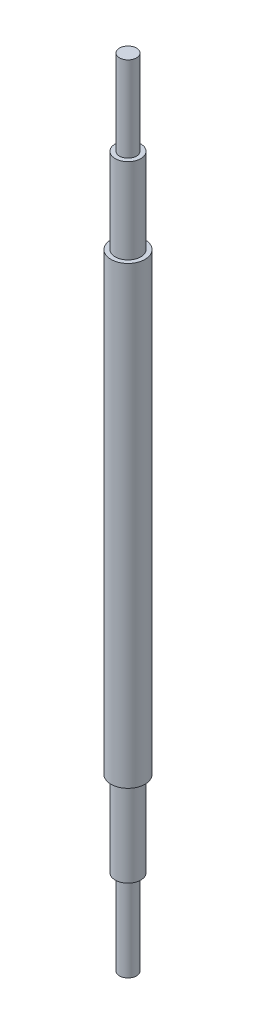
ISO-10303-21;
HEADER;
FILE_DESCRIPTION(('STEP AP214'),'2;1');
FILE_NAME('part.step','',(''),(''),'','','');
FILE_SCHEMA(('AUTOMOTIVE_DESIGN { 1 0 10303 214 1 1 1 1 }'));
ENDSEC;
DATA;
#1=APPLICATION_CONTEXT('core data for automotive mechanical design processes');
#2=APPLICATION_PROTOCOL_DEFINITION('international standard','automotive_design',2000,#1);
#3=PRODUCT_CONTEXT('',#1,'mechanical');
#4=PRODUCT('Part','Part','',(#3));
#5=PRODUCT_RELATED_PRODUCT_CATEGORY('part','',(#4));
#6=PRODUCT_DEFINITION_FORMATION('','',#4);
#7=PRODUCT_DEFINITION_CONTEXT('part definition',#1,'design');
#8=PRODUCT_DEFINITION('design','',#6,#7);
#9=PRODUCT_DEFINITION_SHAPE('','',#8);
#10=(LENGTH_UNIT() NAMED_UNIT(*) SI_UNIT(.MILLI.,.METRE.));
#11=(NAMED_UNIT(*) PLANE_ANGLE_UNIT() SI_UNIT($,.RADIAN.));
#12=(NAMED_UNIT(*) SI_UNIT($,.STERADIAN.) SOLID_ANGLE_UNIT());
#13=UNCERTAINTY_MEASURE_WITH_UNIT(LENGTH_MEASURE(1.E-05),#10,'distance_accuracy_value','');
#14=(GEOMETRIC_REPRESENTATION_CONTEXT(3) GLOBAL_UNCERTAINTY_ASSIGNED_CONTEXT((#13)) GLOBAL_UNIT_ASSIGNED_CONTEXT((#10,
#11,#12)) REPRESENTATION_CONTEXT('',''));
#15=CARTESIAN_POINT('',(0.,0.,0.));
#16=DIRECTION('',(0.,0.,1.));
#17=DIRECTION('',(1.,0.,0.));
#18=AXIS2_PLACEMENT_3D('',#15,#16,#17);
#19=CARTESIAN_POINT('',(0.,106.8,0.));
#20=DIRECTION('',(0.,-1.,0.));
#21=DIRECTION('',(0.,0.,-1.));
#22=AXIS2_PLACEMENT_3D('',#19,#20,#21);
#23=CYLINDRICAL_SURFACE('',#22,4.);
#24=CARTESIAN_POINT('',(0.,106.8,0.));
#25=DIRECTION('',(0.,1.,0.));
#26=DIRECTION('',(0.,0.,1.));
#27=AXIS2_PLACEMENT_3D('',#24,#25,#26);
#28=CIRCLE('',#27,4.);
#29=CARTESIAN_POINT('',(0.,106.8,4.));
#30=VERTEX_POINT('',#29);
#31=EDGE_CURVE('E41',#30,#30,#28,.T.);
#32=ORIENTED_EDGE('',*,*,#31,.F.);
#33=EDGE_LOOP('',(#32));
#34=FACE_BOUND('',#33,.T.);
#35=CARTESIAN_POINT('',(0.,0.,0.));
#36=DIRECTION('',(0.,1.,0.));
#37=DIRECTION('',(0.,0.,1.));
#38=AXIS2_PLACEMENT_3D('',#35,#36,#37);
#39=CIRCLE('',#38,4.);
#40=CARTESIAN_POINT('',(0.,0.,4.));
#41=VERTEX_POINT('',#40);
#42=EDGE_CURVE('E45',#41,#41,#39,.T.);
#43=ORIENTED_EDGE('',*,*,#42,.T.);
#44=EDGE_LOOP('',(#43));
#45=FACE_BOUND('',#44,.T.);
#46=ADVANCED_FACE('F35',(#34,#45),#23,.T.);
#47=CARTESIAN_POINT('',(0.,106.8,0.));
#48=DIRECTION('',(0.,1.,0.));
#49=DIRECTION('',(0.,0.,1.));
#50=AXIS2_PLACEMENT_3D('',#47,#48,#49);
#51=PLANE('',#50);
#52=CARTESIAN_POINT('',(0.,106.8,0.));
#53=DIRECTION('',(0.,1.,0.));
#54=DIRECTION('',(0.,0.,1.));
#55=AXIS2_PLACEMENT_3D('',#52,#53,#54);
#56=CIRCLE('',#55,3.);
#57=CARTESIAN_POINT('',(0.,106.8,3.));
#58=VERTEX_POINT('',#57);
#59=EDGE_CURVE('E52',#58,#58,#56,.T.);
#60=ORIENTED_EDGE('',*,*,#59,.F.);
#61=EDGE_LOOP('',(#60));
#62=FACE_BOUND('',#61,.T.);
#63=ORIENTED_EDGE('',*,*,#31,.T.);
#64=EDGE_LOOP('',(#63));
#65=FACE_BOUND('',#64,.T.);
#66=ADVANCED_FACE('F98',(#62,#65),#51,.T.);
#67=CARTESIAN_POINT('',(0.,0.,0.));
#68=DIRECTION('',(0.,1.,0.));
#69=DIRECTION('',(0.,0.,1.));
#70=AXIS2_PLACEMENT_3D('',#67,#68,#69);
#71=PLANE('',#70);
#72=CARTESIAN_POINT('',(0.,0.,0.));
#73=DIRECTION('',(0.,1.,0.));
#74=DIRECTION('',(0.,0.,1.));
#75=AXIS2_PLACEMENT_3D('',#72,#73,#74);
#76=CIRCLE('',#75,3.);
#77=CARTESIAN_POINT('',(0.,0.,3.));
#78=VERTEX_POINT('',#77);
#79=EDGE_CURVE('E10',#78,#78,#76,.F.);
#80=ORIENTED_EDGE('',*,*,#79,.F.);
#81=EDGE_LOOP('',(#80));
#82=FACE_BOUND('',#81,.T.);
#83=ORIENTED_EDGE('',*,*,#42,.F.);
#84=EDGE_LOOP('',(#83));
#85=FACE_BOUND('',#84,.T.);
#86=ADVANCED_FACE('F103',(#82,#85),#71,.F.);
#87=CARTESIAN_POINT('',(0.,126.8,0.));
#88=DIRECTION('',(0.,-1.,0.));
#89=DIRECTION('',(0.,0.,-1.));
#90=AXIS2_PLACEMENT_3D('',#87,#88,#89);
#91=CYLINDRICAL_SURFACE('',#90,3.);
#92=CARTESIAN_POINT('',(0.,126.8,0.));
#93=DIRECTION('',(0.,1.,0.));
#94=DIRECTION('',(0.,0.,1.));
#95=AXIS2_PLACEMENT_3D('',#92,#93,#94);
#96=CIRCLE('',#95,3.);
#97=CARTESIAN_POINT('',(0.,126.8,3.));
#98=VERTEX_POINT('',#97);
#99=EDGE_CURVE('E50',#98,#98,#96,.T.);
#100=ORIENTED_EDGE('',*,*,#99,.F.);
#101=EDGE_LOOP('',(#100));
#102=FACE_BOUND('',#101,.T.);
#103=ORIENTED_EDGE('',*,*,#59,.T.);
#104=EDGE_LOOP('',(#103));
#105=FACE_BOUND('',#104,.T.);
#106=ADVANCED_FACE('F110',(#102,#105),#91,.T.);
#107=CARTESIAN_POINT('',(0.,126.8,0.));
#108=DIRECTION('',(0.,1.,0.));
#109=DIRECTION('',(0.,0.,1.));
#110=AXIS2_PLACEMENT_3D('',#107,#108,#109);
#111=PLANE('',#110);
#112=CARTESIAN_POINT('',(0.,126.8,0.));
#113=DIRECTION('',(0.,1.,0.));
#114=DIRECTION('',(0.,0.,1.));
#115=AXIS2_PLACEMENT_3D('',#112,#113,#114);
#116=CIRCLE('',#115,2.);
#117=CARTESIAN_POINT('',(0.,126.8,2.));
#118=VERTEX_POINT('',#117);
#119=EDGE_CURVE('E58',#118,#118,#116,.T.);
#120=ORIENTED_EDGE('',*,*,#119,.F.);
#121=EDGE_LOOP('',(#120));
#122=FACE_BOUND('',#121,.T.);
#123=ORIENTED_EDGE('',*,*,#99,.T.);
#124=EDGE_LOOP('',(#123));
#125=FACE_BOUND('',#124,.T.);
#126=ADVANCED_FACE('F115',(#122,#125),#111,.T.);
#127=CARTESIAN_POINT('',(0.,146.8,0.));
#128=DIRECTION('',(0.,-1.,0.));
#129=DIRECTION('',(0.,0.,-1.));
#130=AXIS2_PLACEMENT_3D('',#127,#128,#129);
#131=CYLINDRICAL_SURFACE('',#130,2.);
#132=CARTESIAN_POINT('',(0.,146.8,0.));
#133=DIRECTION('',(0.,1.,0.));
#134=DIRECTION('',(0.,0.,1.));
#135=AXIS2_PLACEMENT_3D('',#132,#133,#134);
#136=CIRCLE('',#135,2.);
#137=CARTESIAN_POINT('',(0.,146.8,2.));
#138=VERTEX_POINT('',#137);
#139=EDGE_CURVE('E55',#138,#138,#136,.T.);
#140=ORIENTED_EDGE('',*,*,#139,.F.);
#141=EDGE_LOOP('',(#140));
#142=FACE_BOUND('',#141,.T.);
#143=ORIENTED_EDGE('',*,*,#119,.T.);
#144=EDGE_LOOP('',(#143));
#145=FACE_BOUND('',#144,.T.);
#146=ADVANCED_FACE('F94',(#142,#145),#131,.T.);
#147=CARTESIAN_POINT('',(0.,146.8,0.));
#148=DIRECTION('',(0.,1.,0.));
#149=DIRECTION('',(0.,0.,1.));
#150=AXIS2_PLACEMENT_3D('',#147,#148,#149);
#151=PLANE('',#150);
#152=ORIENTED_EDGE('',*,*,#139,.T.);
#153=EDGE_LOOP('',(#152));
#154=FACE_BOUND('',#153,.T.);
#155=ADVANCED_FACE('F89',(#154),#151,.T.);
#156=CARTESIAN_POINT('',(0.,-20.,0.));
#157=DIRECTION('',(0.,1.,0.));
#158=DIRECTION('',(0.,0.,1.));
#159=AXIS2_PLACEMENT_3D('',#156,#157,#158);
#160=CYLINDRICAL_SURFACE('',#159,3.);
#161=CARTESIAN_POINT('',(0.,-20.,0.));
#162=DIRECTION('',(0.,-1.,0.));
#163=DIRECTION('',(0.,0.,-1.));
#164=AXIS2_PLACEMENT_3D('',#161,#162,#163);
#165=CIRCLE('',#164,3.);
#166=CARTESIAN_POINT('',(0.,-20.,-3.));
#167=VERTEX_POINT('',#166);
#168=EDGE_CURVE('E61',#167,#167,#165,.T.);
#169=ORIENTED_EDGE('',*,*,#168,.F.);
#170=EDGE_LOOP('',(#169));
#171=FACE_BOUND('',#170,.T.);
#172=ORIENTED_EDGE('',*,*,#79,.T.);
#173=EDGE_LOOP('',(#172));
#174=FACE_BOUND('',#173,.T.);
#175=ADVANCED_FACE('F84',(#171,#174),#160,.T.);
#176=CARTESIAN_POINT('',(0.,-20.,0.));
#177=DIRECTION('',(0.,-1.,0.));
#178=DIRECTION('',(0.,0.,-1.));
#179=AXIS2_PLACEMENT_3D('',#176,#177,#178);
#180=PLANE('',#179);
#181=CARTESIAN_POINT('',(0.,-20.,0.));
#182=DIRECTION('',(0.,-1.,0.));
#183=DIRECTION('',(0.,0.,-1.));
#184=AXIS2_PLACEMENT_3D('',#181,#182,#183);
#185=CIRCLE('',#184,2.);
#186=CARTESIAN_POINT('',(0.,-20.,-2.));
#187=VERTEX_POINT('',#186);
#188=EDGE_CURVE('E67',#187,#187,#185,.T.);
#189=ORIENTED_EDGE('',*,*,#188,.F.);
#190=EDGE_LOOP('',(#189));
#191=FACE_BOUND('',#190,.T.);
#192=ORIENTED_EDGE('',*,*,#168,.T.);
#193=EDGE_LOOP('',(#192));
#194=FACE_BOUND('',#193,.T.);
#195=ADVANCED_FACE('F78',(#191,#194),#180,.T.);
#196=CARTESIAN_POINT('',(0.,-40.,0.));
#197=DIRECTION('',(0.,1.,0.));
#198=DIRECTION('',(0.,0.,1.));
#199=AXIS2_PLACEMENT_3D('',#196,#197,#198);
#200=CYLINDRICAL_SURFACE('',#199,2.);
#201=CARTESIAN_POINT('',(0.,-40.,0.));
#202=DIRECTION('',(0.,-1.,0.));
#203=DIRECTION('',(0.,0.,-1.));
#204=AXIS2_PLACEMENT_3D('',#201,#202,#203);
#205=CIRCLE('',#204,2.);
#206=CARTESIAN_POINT('',(0.,-40.,-2.));
#207=VERTEX_POINT('',#206);
#208=EDGE_CURVE('E66',#207,#207,#205,.T.);
#209=ORIENTED_EDGE('',*,*,#208,.F.);
#210=EDGE_LOOP('',(#209));
#211=FACE_BOUND('',#210,.T.);
#212=ORIENTED_EDGE('',*,*,#188,.T.);
#213=EDGE_LOOP('',(#212));
#214=FACE_BOUND('',#213,.T.);
#215=ADVANCED_FACE('F75',(#211,#214),#200,.T.);
#216=CARTESIAN_POINT('',(0.,-40.,0.));
#217=DIRECTION('',(0.,-1.,0.));
#218=DIRECTION('',(0.,0.,-1.));
#219=AXIS2_PLACEMENT_3D('',#216,#217,#218);
#220=PLANE('',#219);
#221=ORIENTED_EDGE('',*,*,#208,.T.);
#222=EDGE_LOOP('',(#221));
#223=FACE_BOUND('',#222,.T.);
#224=ADVANCED_FACE('F73',(#223),#220,.T.);
#225=CLOSED_SHELL('',(#46,#66,#86,#106,#126,#146,#155,#175,#195,#215,#224));
#226=MANIFOLD_SOLID_BREP('B2',#225);
#227=ADVANCED_BREP_SHAPE_REPRESENTATION('',(#18,#226),#14);
#228=SHAPE_DEFINITION_REPRESENTATION(#9,#227);
ENDSEC;
END-ISO-10303-21;
